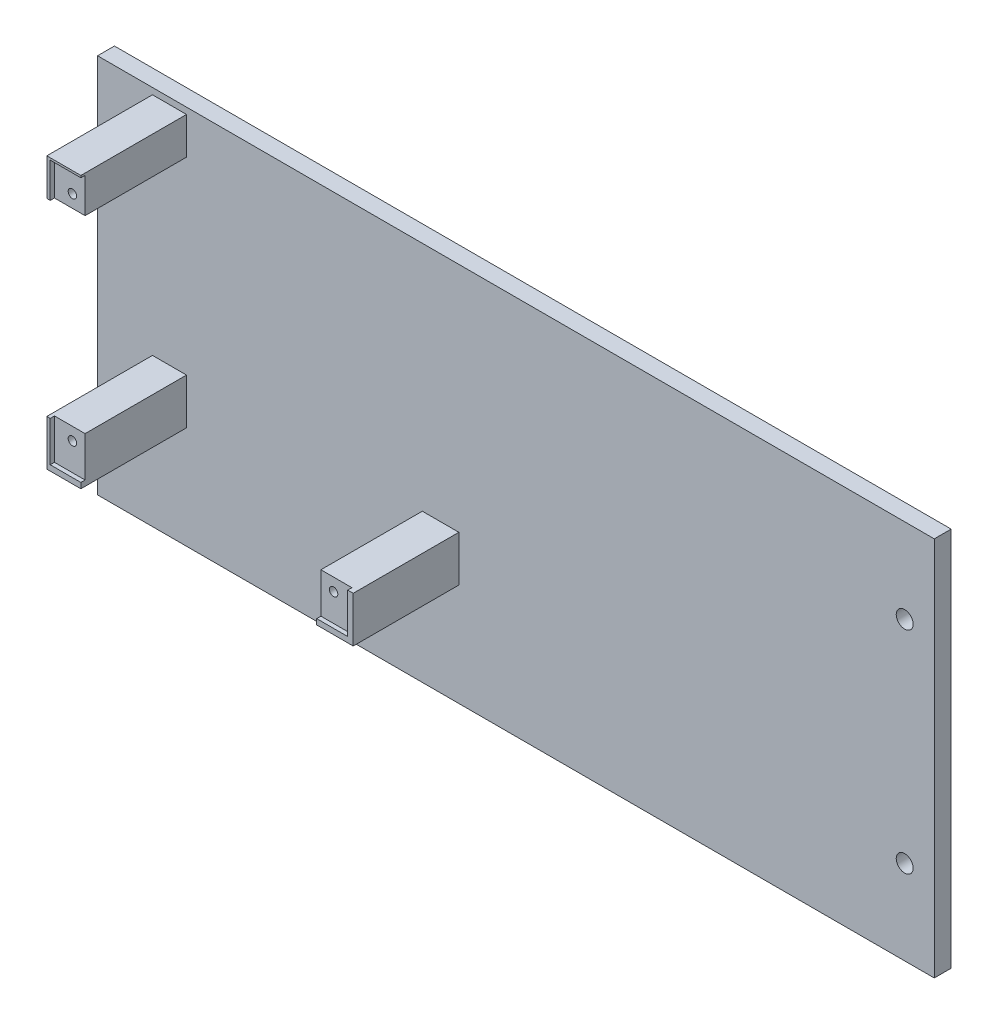
ISO-10303-21;
HEADER;
FILE_DESCRIPTION(('STEP AP214'),'2;1');
FILE_NAME('part.step','',(''),(''),'','','');
FILE_SCHEMA(('AUTOMOTIVE_DESIGN { 1 0 10303 214 1 1 1 1 }'));
ENDSEC;
DATA;
#1=APPLICATION_CONTEXT('core data for automotive mechanical design processes');
#2=APPLICATION_PROTOCOL_DEFINITION('international standard','automotive_design',2000,#1);
#3=PRODUCT_CONTEXT('',#1,'mechanical');
#4=PRODUCT('Part','Part','',(#3));
#5=PRODUCT_RELATED_PRODUCT_CATEGORY('part','',(#4));
#6=PRODUCT_DEFINITION_FORMATION('','',#4);
#7=PRODUCT_DEFINITION_CONTEXT('part definition',#1,'design');
#8=PRODUCT_DEFINITION('design','',#6,#7);
#9=PRODUCT_DEFINITION_SHAPE('','',#8);
#10=(LENGTH_UNIT() NAMED_UNIT(*) SI_UNIT(.MILLI.,.METRE.));
#11=(NAMED_UNIT(*) PLANE_ANGLE_UNIT() SI_UNIT($,.RADIAN.));
#12=(NAMED_UNIT(*) SI_UNIT($,.STERADIAN.) SOLID_ANGLE_UNIT());
#13=UNCERTAINTY_MEASURE_WITH_UNIT(LENGTH_MEASURE(1.E-05),#10,'distance_accuracy_value','');
#14=(GEOMETRIC_REPRESENTATION_CONTEXT(3) GLOBAL_UNCERTAINTY_ASSIGNED_CONTEXT((#13)) GLOBAL_UNIT_ASSIGNED_CONTEXT((#10,
#11,#12)) REPRESENTATION_CONTEXT('',''));
#15=CARTESIAN_POINT('',(0.,0.,0.));
#16=DIRECTION('',(0.,0.,1.));
#17=DIRECTION('',(1.,0.,0.));
#18=AXIS2_PLACEMENT_3D('',#15,#16,#17);
#19=CARTESIAN_POINT('',(0.,0.,4.));
#20=DIRECTION('',(0.,0.,-1.));
#21=DIRECTION('',(-1.,0.,0.));
#22=AXIS2_PLACEMENT_3D('',#19,#20,#21);
#23=PLANE('',#22);
#24=DIRECTION('',(-1.,0.,0.));
#25=VECTOR('',#24,1.);
#26=CARTESIAN_POINT('',(0.,88.5,4.));
#27=LINE('',#26,#25);
#28=CARTESIAN_POINT('',(21.0526525727963,88.5,4.));
#29=VERTEX_POINT('',#28);
#30=CARTESIAN_POINT('',(13.,88.5,4.));
#31=VERTEX_POINT('',#30);
#32=EDGE_CURVE('E292',#29,#31,#27,.T.);
#33=ORIENTED_EDGE('',*,*,#32,.F.);
#34=DIRECTION('',(0.,-1.,0.));
#35=VECTOR('',#34,1.);
#36=CARTESIAN_POINT('',(21.0526525727963,0.,4.));
#37=LINE('',#36,#35);
#38=CARTESIAN_POINT('',(21.0526525727963,79.7501847935628,4.));
#39=VERTEX_POINT('',#38);
#40=EDGE_CURVE('E347',#29,#39,#37,.T.);
#41=ORIENTED_EDGE('',*,*,#40,.T.);
#42=DIRECTION('',(-1.,0.,0.));
#43=VECTOR('',#42,1.);
#44=CARTESIAN_POINT('',(0.,79.7501847935628,4.));
#45=LINE('',#44,#43);
#46=CARTESIAN_POINT('',(13.,79.7501847935628,4.));
#47=VERTEX_POINT('',#46);
#48=EDGE_CURVE('E352',#39,#47,#45,.T.);
#49=ORIENTED_EDGE('',*,*,#48,.T.);
#50=DIRECTION('',(0.,-1.,0.));
#51=VECTOR('',#50,1.);
#52=CARTESIAN_POINT('',(13.,0.,4.));
#53=LINE('',#52,#51);
#54=EDGE_CURVE('E297',#31,#47,#53,.T.);
#55=ORIENTED_EDGE('',*,*,#54,.F.);
#56=EDGE_LOOP('',(#33,#41,#49,#55));
#57=FACE_BOUND('',#56,.T.);
#58=DIRECTION('',(-1.,0.,0.));
#59=VECTOR('',#58,1.);
#60=CARTESIAN_POINT('',(0.,24.2800212514805,4.));
#61=LINE('',#60,#59);
#62=CARTESIAN_POINT('',(85.5,24.2800212514805,4.));
#63=VERTEX_POINT('',#62);
#64=CARTESIAN_POINT('',(76.8556043079379,24.2800212514805,4.));
#65=VERTEX_POINT('',#64);
#66=EDGE_CURVE('E241',#63,#65,#61,.T.);
#67=ORIENTED_EDGE('',*,*,#66,.T.);
#68=DIRECTION('',(0.,1.,0.));
#69=VECTOR('',#68,1.);
#70=CARTESIAN_POINT('',(76.855604307938,2.21650946346992E-13,4.));
#71=LINE('',#70,#69);
#72=CARTESIAN_POINT('',(76.8556043079379,35.0920276336106,4.));
#73=VERTEX_POINT('',#72);
#74=EDGE_CURVE('E56',#65,#73,#71,.T.);
#75=ORIENTED_EDGE('',*,*,#74,.T.);
#76=DIRECTION('',(1.,0.,0.));
#77=VECTOR('',#76,1.);
#78=CARTESIAN_POINT('',(0.,35.0920276336106,4.));
#79=LINE('',#78,#77);
#80=CARTESIAN_POINT('',(85.5,35.0920276336106,4.));
#81=VERTEX_POINT('',#80);
#82=EDGE_CURVE('E334',#73,#81,#79,.T.);
#83=ORIENTED_EDGE('',*,*,#82,.T.);
#84=DIRECTION('',(0.,-1.,0.));
#85=VECTOR('',#84,1.);
#86=CARTESIAN_POINT('',(85.5,-1.09743817718166E-13,4.));
#87=LINE('',#86,#85);
#88=EDGE_CURVE('E63',#81,#63,#87,.T.);
#89=ORIENTED_EDGE('',*,*,#88,.T.);
#90=EDGE_LOOP('',(#67,#75,#83,#89));
#91=FACE_BOUND('',#90,.T.);
#92=CARTESIAN_POINT('',(191.,70.,4.));
#93=DIRECTION('',(0.,0.,-1.));
#94=DIRECTION('',(-1.,0.,0.));
#95=AXIS2_PLACEMENT_3D('',#92,#93,#94);
#96=CIRCLE('',#95,2.);
#97=CARTESIAN_POINT('',(189.,70.,4.));
#98=VERTEX_POINT('',#97);
#99=EDGE_CURVE('E398',#98,#98,#96,.T.);
#100=ORIENTED_EDGE('',*,*,#99,.T.);
#101=EDGE_LOOP('',(#100));
#102=FACE_BOUND('',#101,.T.);
#103=CARTESIAN_POINT('',(7.,20.,4.));
#104=DIRECTION('',(0.,0.,-1.));
#105=DIRECTION('',(-1.,0.,0.));
#106=AXIS2_PLACEMENT_3D('',#103,#104,#105);
#107=CIRCLE('',#106,2.);
#108=CARTESIAN_POINT('',(5.,20.,4.));
#109=VERTEX_POINT('',#108);
#110=EDGE_CURVE('E395',#109,#109,#107,.T.);
#111=ORIENTED_EDGE('',*,*,#110,.T.);
#112=EDGE_LOOP('',(#111));
#113=FACE_BOUND('',#112,.T.);
#114=CARTESIAN_POINT('',(7.00000000000001,70.,4.));
#115=DIRECTION('',(0.,0.,-1.));
#116=DIRECTION('',(-1.,0.,0.));
#117=AXIS2_PLACEMENT_3D('',#114,#115,#116);
#118=CIRCLE('',#117,2.);
#119=CARTESIAN_POINT('',(5.00000000000001,70.,4.));
#120=VERTEX_POINT('',#119);
#121=EDGE_CURVE('E387',#120,#120,#118,.T.);
#122=ORIENTED_EDGE('',*,*,#121,.T.);
#123=EDGE_LOOP('',(#122));
#124=FACE_BOUND('',#123,.T.);
#125=CARTESIAN_POINT('',(191.,20.,4.));
#126=DIRECTION('',(0.,0.,-1.));
#127=DIRECTION('',(-1.,0.,0.));
#128=AXIS2_PLACEMENT_3D('',#125,#126,#127);
#129=CIRCLE('',#128,2.);
#130=CARTESIAN_POINT('',(189.,20.,4.));
#131=VERTEX_POINT('',#130);
#132=EDGE_CURVE('E404',#131,#131,#129,.T.);
#133=ORIENTED_EDGE('',*,*,#132,.T.);
#134=EDGE_LOOP('',(#133));
#135=FACE_BOUND('',#134,.T.);
#136=DIRECTION('',(0.,-1.,0.));
#137=VECTOR('',#136,1.);
#138=CARTESIAN_POINT('',(0.,0.,4.));
#139=LINE('',#138,#137);
#140=CARTESIAN_POINT('',(0.,90.,4.));
#141=VERTEX_POINT('',#140);
#142=CARTESIAN_POINT('',(0.,0.,4.));
#143=VERTEX_POINT('',#142);
#144=EDGE_CURVE('E408',#141,#143,#139,.T.);
#145=ORIENTED_EDGE('',*,*,#144,.T.);
#146=DIRECTION('',(1.,0.,0.));
#147=VECTOR('',#146,1.);
#148=CARTESIAN_POINT('',(0.,0.,4.));
#149=LINE('',#148,#147);
#150=CARTESIAN_POINT('',(198.,0.,4.));
#151=VERTEX_POINT('',#150);
#152=EDGE_CURVE('E411',#143,#151,#149,.T.);
#153=ORIENTED_EDGE('',*,*,#152,.T.);
#154=DIRECTION('',(0.,1.,0.));
#155=VECTOR('',#154,1.);
#156=CARTESIAN_POINT('',(198.,0.,4.));
#157=LINE('',#156,#155);
#158=CARTESIAN_POINT('',(198.,90.,4.));
#159=VERTEX_POINT('',#158);
#160=EDGE_CURVE('E414',#151,#159,#157,.T.);
#161=ORIENTED_EDGE('',*,*,#160,.T.);
#162=DIRECTION('',(-1.,0.,0.));
#163=VECTOR('',#162,1.);
#164=CARTESIAN_POINT('',(0.,90.,4.));
#165=LINE('',#164,#163);
#166=EDGE_CURVE('E416',#159,#141,#165,.T.);
#167=ORIENTED_EDGE('',*,*,#166,.T.);
#168=EDGE_LOOP('',(#145,#153,#161,#167));
#169=FACE_BOUND('',#168,.T.);
#170=DIRECTION('',(0.,1.,0.));
#171=VECTOR('',#170,1.);
#172=CARTESIAN_POINT('',(21.0526525727964,0.,4.));
#173=LINE('',#172,#171);
#174=CARTESIAN_POINT('',(21.0526525727963,24.2800212514805,4.));
#175=VERTEX_POINT('',#174);
#176=CARTESIAN_POINT('',(21.0526525727963,35.0920276336106,4.));
#177=VERTEX_POINT('',#176);
#178=EDGE_CURVE('E366',#175,#177,#173,.T.);
#179=ORIENTED_EDGE('',*,*,#178,.F.);
#180=DIRECTION('',(1.,0.,0.));
#181=VECTOR('',#180,1.);
#182=CARTESIAN_POINT('',(0.,24.2800212514805,4.));
#183=LINE('',#182,#181);
#184=CARTESIAN_POINT('',(13.,24.2800212514805,4.));
#185=VERTEX_POINT('',#184);
#186=EDGE_CURVE('E215',#185,#175,#183,.T.);
#187=ORIENTED_EDGE('',*,*,#186,.F.);
#188=DIRECTION('',(0.,-1.,0.));
#189=VECTOR('',#188,1.);
#190=CARTESIAN_POINT('',(13.,0.,4.));
#191=LINE('',#190,#189);
#192=CARTESIAN_POINT('',(13.,35.0920276336106,4.));
#193=VERTEX_POINT('',#192);
#194=EDGE_CURVE('E260',#193,#185,#191,.T.);
#195=ORIENTED_EDGE('',*,*,#194,.F.);
#196=DIRECTION('',(-1.,0.,0.));
#197=VECTOR('',#196,1.);
#198=CARTESIAN_POINT('',(0.,35.0920276336106,4.));
#199=LINE('',#198,#197);
#200=EDGE_CURVE('E371',#177,#193,#199,.T.);
#201=ORIENTED_EDGE('',*,*,#200,.F.);
#202=EDGE_LOOP('',(#179,#187,#195,#201));
#203=FACE_BOUND('',#202,.T.);
#204=ADVANCED_FACE('F39',(#57,#91,#102,#113,#124,#135,#169,#203),#23,.F.);
#205=CARTESIAN_POINT('',(0.,0.,4.));
#206=DIRECTION('',(1.,0.,0.));
#207=DIRECTION('',(0.,0.,-1.));
#208=AXIS2_PLACEMENT_3D('',#205,#206,#207);
#209=PLANE('',#208);
#210=DIRECTION('',(0.,-1.,0.));
#211=VECTOR('',#210,1.);
#212=CARTESIAN_POINT('',(0.,0.,0.));
#213=LINE('',#212,#211);
#214=CARTESIAN_POINT('',(0.,90.,0.));
#215=VERTEX_POINT('',#214);
#216=CARTESIAN_POINT('',(0.,0.,0.));
#217=VERTEX_POINT('',#216);
#218=EDGE_CURVE('E407',#215,#217,#213,.T.);
#219=ORIENTED_EDGE('',*,*,#218,.T.);
#220=DIRECTION('',(0.,0.,-1.));
#221=VECTOR('',#220,1.);
#222=CARTESIAN_POINT('',(0.,0.,4.));
#223=LINE('',#222,#221);
#224=EDGE_CURVE('E11',#143,#217,#223,.T.);
#225=ORIENTED_EDGE('',*,*,#224,.F.);
#226=ORIENTED_EDGE('',*,*,#144,.F.);
#227=DIRECTION('',(0.,0.,-1.));
#228=VECTOR('',#227,1.);
#229=CARTESIAN_POINT('',(0.,90.,4.));
#230=LINE('',#229,#228);
#231=EDGE_CURVE('E418',#141,#215,#230,.T.);
#232=ORIENTED_EDGE('',*,*,#231,.T.);
#233=EDGE_LOOP('',(#219,#225,#226,#232));
#234=FACE_BOUND('',#233,.T.);
#235=ADVANCED_FACE('F41',(#234),#209,.F.);
#236=CARTESIAN_POINT('',(0.,0.,4.));
#237=DIRECTION('',(0.,1.,0.));
#238=DIRECTION('',(0.,0.,1.));
#239=AXIS2_PLACEMENT_3D('',#236,#237,#238);
#240=PLANE('',#239);
#241=DIRECTION('',(1.,0.,0.));
#242=VECTOR('',#241,1.);
#243=CARTESIAN_POINT('',(0.,0.,0.));
#244=LINE('',#243,#242);
#245=CARTESIAN_POINT('',(198.,0.,0.));
#246=VERTEX_POINT('',#245);
#247=EDGE_CURVE('E421',#217,#246,#244,.T.);
#248=ORIENTED_EDGE('',*,*,#247,.T.);
#249=DIRECTION('',(0.,0.,-1.));
#250=VECTOR('',#249,1.);
#251=CARTESIAN_POINT('',(198.,0.,4.));
#252=LINE('',#251,#250);
#253=EDGE_CURVE('E48',#151,#246,#252,.T.);
#254=ORIENTED_EDGE('',*,*,#253,.F.);
#255=ORIENTED_EDGE('',*,*,#152,.F.);
#256=ORIENTED_EDGE('',*,*,#224,.T.);
#257=EDGE_LOOP('',(#248,#254,#255,#256));
#258=FACE_BOUND('',#257,.T.);
#259=ADVANCED_FACE('F475',(#258),#240,.F.);
#260=CARTESIAN_POINT('',(198.,0.,4.));
#261=DIRECTION('',(-1.,0.,0.));
#262=DIRECTION('',(0.,0.,1.));
#263=AXIS2_PLACEMENT_3D('',#260,#261,#262);
#264=PLANE('',#263);
#265=DIRECTION('',(0.,1.,0.));
#266=VECTOR('',#265,1.);
#267=CARTESIAN_POINT('',(198.,0.,0.));
#268=LINE('',#267,#266);
#269=CARTESIAN_POINT('',(198.,90.,0.));
#270=VERTEX_POINT('',#269);
#271=EDGE_CURVE('E423',#246,#270,#268,.T.);
#272=ORIENTED_EDGE('',*,*,#271,.T.);
#273=DIRECTION('',(0.,0.,-1.));
#274=VECTOR('',#273,1.);
#275=CARTESIAN_POINT('',(198.,90.,4.));
#276=LINE('',#275,#274);
#277=EDGE_CURVE('E428',#159,#270,#276,.T.);
#278=ORIENTED_EDGE('',*,*,#277,.F.);
#279=ORIENTED_EDGE('',*,*,#160,.F.);
#280=ORIENTED_EDGE('',*,*,#253,.T.);
#281=EDGE_LOOP('',(#272,#278,#279,#280));
#282=FACE_BOUND('',#281,.T.);
#283=ADVANCED_FACE('F487',(#282),#264,.F.);
#284=CARTESIAN_POINT('',(0.,90.,4.));
#285=DIRECTION('',(0.,-1.,0.));
#286=DIRECTION('',(0.,0.,-1.));
#287=AXIS2_PLACEMENT_3D('',#284,#285,#286);
#288=PLANE('',#287);
#289=DIRECTION('',(-1.,0.,0.));
#290=VECTOR('',#289,1.);
#291=CARTESIAN_POINT('',(0.,90.,0.));
#292=LINE('',#291,#290);
#293=EDGE_CURVE('E412',#270,#215,#292,.T.);
#294=ORIENTED_EDGE('',*,*,#293,.T.);
#295=ORIENTED_EDGE('',*,*,#231,.F.);
#296=ORIENTED_EDGE('',*,*,#166,.F.);
#297=ORIENTED_EDGE('',*,*,#277,.T.);
#298=EDGE_LOOP('',(#294,#295,#296,#297));
#299=FACE_BOUND('',#298,.T.);
#300=ADVANCED_FACE('F484',(#299),#288,.F.);
#301=CARTESIAN_POINT('',(0.,0.,0.));
#302=DIRECTION('',(0.,0.,-1.));
#303=DIRECTION('',(-1.,0.,0.));
#304=AXIS2_PLACEMENT_3D('',#301,#302,#303);
#305=PLANE('',#304);
#306=CARTESIAN_POINT('',(18.0526525727963,32.0920276336106,0.));
#307=DIRECTION('',(0.,0.,1.));
#308=DIRECTION('',(1.,0.,0.));
#309=AXIS2_PLACEMENT_3D('',#306,#307,#308);
#310=CIRCLE('',#309,0.999999999999998);
#311=CARTESIAN_POINT('',(19.0526525727963,32.0920276336106,0.));
#312=VERTEX_POINT('',#311);
#313=EDGE_CURVE('E437',#312,#312,#310,.T.);
#314=ORIENTED_EDGE('',*,*,#313,.T.);
#315=EDGE_LOOP('',(#314));
#316=FACE_BOUND('',#315,.T.);
#317=CARTESIAN_POINT('',(79.8556043079379,32.0920276336106,0.));
#318=DIRECTION('',(0.,0.,1.));
#319=DIRECTION('',(1.,0.,0.));
#320=AXIS2_PLACEMENT_3D('',#317,#318,#319);
#321=CIRCLE('',#320,0.999999999999998);
#322=CARTESIAN_POINT('',(80.8556043079379,32.0920276336106,0.));
#323=VERTEX_POINT('',#322);
#324=EDGE_CURVE('E442',#323,#323,#321,.T.);
#325=ORIENTED_EDGE('',*,*,#324,.T.);
#326=EDGE_LOOP('',(#325));
#327=FACE_BOUND('',#326,.T.);
#328=CARTESIAN_POINT('',(18.0526525727963,82.7501847935628,0.));
#329=DIRECTION('',(0.,0.,1.));
#330=DIRECTION('',(1.,0.,0.));
#331=AXIS2_PLACEMENT_3D('',#328,#329,#330);
#332=CIRCLE('',#331,0.999999999999998);
#333=CARTESIAN_POINT('',(19.0526525727963,82.7501847935628,0.));
#334=VERTEX_POINT('',#333);
#335=EDGE_CURVE('E434',#334,#334,#332,.T.);
#336=ORIENTED_EDGE('',*,*,#335,.T.);
#337=EDGE_LOOP('',(#336));
#338=FACE_BOUND('',#337,.T.);
#339=CARTESIAN_POINT('',(191.,70.,0.));
#340=DIRECTION('',(0.,0.,-1.));
#341=DIRECTION('',(-1.,0.,0.));
#342=AXIS2_PLACEMENT_3D('',#339,#340,#341);
#343=CIRCLE('',#342,2.);
#344=CARTESIAN_POINT('',(189.,70.,0.));
#345=VERTEX_POINT('',#344);
#346=EDGE_CURVE('E384',#345,#345,#343,.T.);
#347=ORIENTED_EDGE('',*,*,#346,.F.);
#348=EDGE_LOOP('',(#347));
#349=FACE_BOUND('',#348,.T.);
#350=CARTESIAN_POINT('',(7.,20.,0.));
#351=DIRECTION('',(0.,0.,-1.));
#352=DIRECTION('',(-1.,0.,0.));
#353=AXIS2_PLACEMENT_3D('',#350,#351,#352);
#354=CIRCLE('',#353,2.);
#355=CARTESIAN_POINT('',(5.,20.,0.));
#356=VERTEX_POINT('',#355);
#357=EDGE_CURVE('E388',#356,#356,#354,.T.);
#358=ORIENTED_EDGE('',*,*,#357,.F.);
#359=EDGE_LOOP('',(#358));
#360=FACE_BOUND('',#359,.T.);
#361=CARTESIAN_POINT('',(7.00000000000001,70.,0.));
#362=DIRECTION('',(0.,0.,-1.));
#363=DIRECTION('',(-1.,0.,0.));
#364=AXIS2_PLACEMENT_3D('',#361,#362,#363);
#365=CIRCLE('',#364,2.);
#366=CARTESIAN_POINT('',(5.00000000000001,70.,0.));
#367=VERTEX_POINT('',#366);
#368=EDGE_CURVE('E383',#367,#367,#365,.T.);
#369=ORIENTED_EDGE('',*,*,#368,.F.);
#370=EDGE_LOOP('',(#369));
#371=FACE_BOUND('',#370,.T.);
#372=CARTESIAN_POINT('',(191.,20.,0.));
#373=DIRECTION('',(0.,0.,-1.));
#374=DIRECTION('',(-1.,0.,0.));
#375=AXIS2_PLACEMENT_3D('',#372,#373,#374);
#376=CIRCLE('',#375,2.);
#377=CARTESIAN_POINT('',(189.,20.,0.));
#378=VERTEX_POINT('',#377);
#379=EDGE_CURVE('E401',#378,#378,#376,.T.);
#380=ORIENTED_EDGE('',*,*,#379,.F.);
#381=EDGE_LOOP('',(#380));
#382=FACE_BOUND('',#381,.T.);
#383=ORIENTED_EDGE('',*,*,#218,.F.);
#384=ORIENTED_EDGE('',*,*,#293,.F.);
#385=ORIENTED_EDGE('',*,*,#271,.F.);
#386=ORIENTED_EDGE('',*,*,#247,.F.);
#387=EDGE_LOOP('',(#383,#384,#385,#386));
#388=FACE_BOUND('',#387,.T.);
#389=ADVANCED_FACE('F451',(#316,#327,#338,#349,#360,#371,#382,#388),#305,.T.);
#390=CARTESIAN_POINT('',(191.,20.,10.));
#391=DIRECTION('',(0.,0.,-1.));
#392=DIRECTION('',(-1.,0.,0.));
#393=AXIS2_PLACEMENT_3D('',#390,#391,#392);
#394=CYLINDRICAL_SURFACE('',#393,2.);
#395=ORIENTED_EDGE('',*,*,#379,.T.);
#396=EDGE_LOOP('',(#395));
#397=FACE_BOUND('',#396,.T.);
#398=ORIENTED_EDGE('',*,*,#132,.F.);
#399=EDGE_LOOP('',(#398));
#400=FACE_BOUND('',#399,.T.);
#401=ADVANCED_FACE('F480',(#397,#400),#394,.F.);
#402=CARTESIAN_POINT('',(7.00000000000001,70.,10.));
#403=DIRECTION('',(0.,0.,-1.));
#404=DIRECTION('',(-1.,0.,0.));
#405=AXIS2_PLACEMENT_3D('',#402,#403,#404);
#406=CYLINDRICAL_SURFACE('',#405,2.);
#407=ORIENTED_EDGE('',*,*,#368,.T.);
#408=EDGE_LOOP('',(#407));
#409=FACE_BOUND('',#408,.T.);
#410=ORIENTED_EDGE('',*,*,#121,.F.);
#411=EDGE_LOOP('',(#410));
#412=FACE_BOUND('',#411,.T.);
#413=ADVANCED_FACE('F606',(#409,#412),#406,.F.);
#414=CARTESIAN_POINT('',(7.,20.,10.));
#415=DIRECTION('',(0.,0.,-1.));
#416=DIRECTION('',(-1.,0.,0.));
#417=AXIS2_PLACEMENT_3D('',#414,#415,#416);
#418=CYLINDRICAL_SURFACE('',#417,2.);
#419=ORIENTED_EDGE('',*,*,#357,.T.);
#420=EDGE_LOOP('',(#419));
#421=FACE_BOUND('',#420,.T.);
#422=ORIENTED_EDGE('',*,*,#110,.F.);
#423=EDGE_LOOP('',(#422));
#424=FACE_BOUND('',#423,.T.);
#425=ADVANCED_FACE('F603',(#421,#424),#418,.F.);
#426=CARTESIAN_POINT('',(191.,70.,10.));
#427=DIRECTION('',(0.,0.,-1.));
#428=DIRECTION('',(-1.,0.,0.));
#429=AXIS2_PLACEMENT_3D('',#426,#427,#428);
#430=CYLINDRICAL_SURFACE('',#429,2.);
#431=ORIENTED_EDGE('',*,*,#346,.T.);
#432=EDGE_LOOP('',(#431));
#433=FACE_BOUND('',#432,.T.);
#434=ORIENTED_EDGE('',*,*,#99,.F.);
#435=EDGE_LOOP('',(#434));
#436=FACE_BOUND('',#435,.T.);
#437=ADVANCED_FACE('F600',(#433,#436),#430,.F.);
#438=CARTESIAN_POINT('',(21.0526525727964,0.,28.));
#439=DIRECTION('',(-1.,0.,0.));
#440=DIRECTION('',(0.,-1.,0.));
#441=AXIS2_PLACEMENT_3D('',#438,#439,#440);
#442=PLANE('',#441);
#443=ORIENTED_EDGE('',*,*,#178,.T.);
#444=DIRECTION('',(0.,0.,-1.));
#445=VECTOR('',#444,1.);
#446=CARTESIAN_POINT('',(21.0526525727963,35.0920276336106,28.));
#447=LINE('',#446,#445);
#448=CARTESIAN_POINT('',(21.0526525727963,35.0920276336106,28.));
#449=VERTEX_POINT('',#448);
#450=EDGE_CURVE('E378',#449,#177,#447,.T.);
#451=ORIENTED_EDGE('',*,*,#450,.F.);
#452=DIRECTION('',(0.,1.,0.));
#453=VECTOR('',#452,1.);
#454=CARTESIAN_POINT('',(21.0526525727964,0.,28.));
#455=LINE('',#454,#453);
#456=CARTESIAN_POINT('',(21.0526525727963,25.5800212514805,28.));
#457=VERTEX_POINT('',#456);
#458=EDGE_CURVE('E370',#457,#449,#455,.T.);
#459=ORIENTED_EDGE('',*,*,#458,.F.);
#460=DIRECTION('',(0.,0.,-1.));
#461=VECTOR('',#460,1.);
#462=CARTESIAN_POINT('',(21.0526525727963,25.5800212514805,29.));
#463=LINE('',#462,#461);
#464=CARTESIAN_POINT('',(21.0526525727963,25.5800212514805,29.));
#465=VERTEX_POINT('',#464);
#466=EDGE_CURVE('E286',#465,#457,#463,.T.);
#467=ORIENTED_EDGE('',*,*,#466,.F.);
#468=DIRECTION('',(0.,1.,0.));
#469=VECTOR('',#468,1.);
#470=CARTESIAN_POINT('',(21.0526525727964,0.,29.));
#471=LINE('',#470,#469);
#472=CARTESIAN_POINT('',(21.0526525727963,24.2800212514805,29.));
#473=VERTEX_POINT('',#472);
#474=EDGE_CURVE('E259',#473,#465,#471,.T.);
#475=ORIENTED_EDGE('',*,*,#474,.F.);
#476=DIRECTION('',(0.,0.,-1.));
#477=VECTOR('',#476,1.);
#478=CARTESIAN_POINT('',(21.0526525727963,24.2800212514805,29.));
#479=LINE('',#478,#477);
#480=EDGE_CURVE('E289',#473,#175,#479,.T.);
#481=ORIENTED_EDGE('',*,*,#480,.T.);
#482=EDGE_LOOP('',(#443,#451,#459,#467,#475,#481));
#483=FACE_BOUND('',#482,.T.);
#484=ADVANCED_FACE('F513',(#483),#442,.F.);
#485=CARTESIAN_POINT('',(0.,35.0920276336106,28.));
#486=DIRECTION('',(0.,-1.,0.));
#487=DIRECTION('',(0.,0.,-1.));
#488=AXIS2_PLACEMENT_3D('',#485,#486,#487);
#489=PLANE('',#488);
#490=ORIENTED_EDGE('',*,*,#200,.T.);
#491=DIRECTION('',(0.,0.,-1.));
#492=VECTOR('',#491,1.);
#493=CARTESIAN_POINT('',(13.,35.0920276336106,29.));
#494=LINE('',#493,#492);
#495=CARTESIAN_POINT('',(13.,35.0920276336106,29.));
#496=VERTEX_POINT('',#495);
#497=EDGE_CURVE('E277',#496,#193,#494,.T.);
#498=ORIENTED_EDGE('',*,*,#497,.F.);
#499=DIRECTION('',(-1.,0.,0.));
#500=VECTOR('',#499,1.);
#501=CARTESIAN_POINT('',(0.,35.0920276336106,29.));
#502=LINE('',#501,#500);
#503=CARTESIAN_POINT('',(13.8000000000001,35.0920276336106,29.));
#504=VERTEX_POINT('',#503);
#505=EDGE_CURVE('E266',#504,#496,#502,.T.);
#506=ORIENTED_EDGE('',*,*,#505,.F.);
#507=DIRECTION('',(0.,0.,-1.));
#508=VECTOR('',#507,1.);
#509=CARTESIAN_POINT('',(13.8000000000001,35.0920276336106,29.));
#510=LINE('',#509,#508);
#511=CARTESIAN_POINT('',(13.8000000000001,35.0920276336106,28.));
#512=VERTEX_POINT('',#511);
#513=EDGE_CURVE('E280',#504,#512,#510,.T.);
#514=ORIENTED_EDGE('',*,*,#513,.T.);
#515=DIRECTION('',(-1.,0.,0.));
#516=VECTOR('',#515,1.);
#517=CARTESIAN_POINT('',(0.,35.0920276336106,28.));
#518=LINE('',#517,#516);
#519=EDGE_CURVE('E373',#449,#512,#518,.T.);
#520=ORIENTED_EDGE('',*,*,#519,.F.);
#521=ORIENTED_EDGE('',*,*,#450,.T.);
#522=EDGE_LOOP('',(#490,#498,#506,#514,#520,#521));
#523=FACE_BOUND('',#522,.T.);
#524=ADVANCED_FACE('F525',(#523),#489,.F.);
#525=CARTESIAN_POINT('',(0.,0.,28.));
#526=DIRECTION('',(0.,0.,1.));
#527=DIRECTION('',(1.,0.,0.));
#528=AXIS2_PLACEMENT_3D('',#525,#526,#527);
#529=PLANE('',#528);
#530=CARTESIAN_POINT('',(18.0526525727963,32.0920276336106,28.));
#531=DIRECTION('',(0.,0.,1.));
#532=DIRECTION('',(1.,0.,0.));
#533=AXIS2_PLACEMENT_3D('',#530,#531,#532);
#534=CIRCLE('',#533,0.999999999999998);
#535=CARTESIAN_POINT('',(19.0526525727963,32.0920276336106,28.));
#536=VERTEX_POINT('',#535);
#537=EDGE_CURVE('E43',#536,#536,#534,.F.);
#538=ORIENTED_EDGE('',*,*,#537,.T.);
#539=EDGE_LOOP('',(#538));
#540=FACE_BOUND('',#539,.T.);
#541=DIRECTION('',(-1.,0.,0.));
#542=VECTOR('',#541,1.);
#543=CARTESIAN_POINT('',(0.,25.5800212514805,28.));
#544=LINE('',#543,#542);
#545=CARTESIAN_POINT('',(13.8000000000001,25.5800212514805,28.));
#546=VERTEX_POINT('',#545);
#547=EDGE_CURVE('E367',#457,#546,#544,.T.);
#548=ORIENTED_EDGE('',*,*,#547,.F.);
#549=ORIENTED_EDGE('',*,*,#458,.T.);
#550=ORIENTED_EDGE('',*,*,#519,.T.);
#551=DIRECTION('',(0.,1.,0.));
#552=VECTOR('',#551,1.);
#553=CARTESIAN_POINT('',(13.8000000000001,0.,28.));
#554=LINE('',#553,#552);
#555=EDGE_CURVE('E375',#546,#512,#554,.T.);
#556=ORIENTED_EDGE('',*,*,#555,.F.);
#557=EDGE_LOOP('',(#548,#549,#550,#556));
#558=FACE_BOUND('',#557,.T.);
#559=ADVANCED_FACE('F530',(#540,#558),#529,.T.);
#560=CARTESIAN_POINT('',(21.0526525727963,0.,28.));
#561=DIRECTION('',(1.,0.,0.));
#562=DIRECTION('',(0.,1.,0.));
#563=AXIS2_PLACEMENT_3D('',#560,#561,#562);
#564=PLANE('',#563);
#565=ORIENTED_EDGE('',*,*,#40,.F.);
#566=DIRECTION('',(0.,0.,-1.));
#567=VECTOR('',#566,1.);
#568=CARTESIAN_POINT('',(21.0526525727963,88.5,29.));
#569=LINE('',#568,#567);
#570=CARTESIAN_POINT('',(21.0526525727963,88.5,29.));
#571=VERTEX_POINT('',#570);
#572=EDGE_CURVE('E324',#571,#29,#569,.T.);
#573=ORIENTED_EDGE('',*,*,#572,.F.);
#574=DIRECTION('',(0.,1.,0.));
#575=VECTOR('',#574,1.);
#576=CARTESIAN_POINT('',(21.0526525727964,0.,29.));
#577=LINE('',#576,#575);
#578=CARTESIAN_POINT('',(21.0526525727963,88.016000509558,29.));
#579=VERTEX_POINT('',#578);
#580=EDGE_CURVE('E296',#579,#571,#577,.T.);
#581=ORIENTED_EDGE('',*,*,#580,.F.);
#582=DIRECTION('',(0.,0.,-1.));
#583=VECTOR('',#582,1.);
#584=CARTESIAN_POINT('',(21.0526525727963,88.016000509558,29.));
#585=LINE('',#584,#583);
#586=CARTESIAN_POINT('',(21.0526525727963,88.016000509558,28.));
#587=VERTEX_POINT('',#586);
#588=EDGE_CURVE('E327',#579,#587,#585,.T.);
#589=ORIENTED_EDGE('',*,*,#588,.T.);
#590=DIRECTION('',(0.,-1.,0.));
#591=VECTOR('',#590,1.);
#592=CARTESIAN_POINT('',(21.0526525727963,0.,28.));
#593=LINE('',#592,#591);
#594=CARTESIAN_POINT('',(21.0526525727963,79.7501847935628,28.));
#595=VERTEX_POINT('',#594);
#596=EDGE_CURVE('E348',#587,#595,#593,.T.);
#597=ORIENTED_EDGE('',*,*,#596,.T.);
#598=DIRECTION('',(0.,0.,-1.));
#599=VECTOR('',#598,1.);
#600=CARTESIAN_POINT('',(21.0526525727963,79.7501847935628,28.));
#601=LINE('',#600,#599);
#602=EDGE_CURVE('E361',#595,#39,#601,.T.);
#603=ORIENTED_EDGE('',*,*,#602,.T.);
#604=EDGE_LOOP('',(#565,#573,#581,#589,#597,#603));
#605=FACE_BOUND('',#604,.T.);
#606=ADVANCED_FACE('F588',(#605),#564,.T.);
#607=CARTESIAN_POINT('',(0.,79.7501847935628,28.));
#608=DIRECTION('',(0.,-1.,0.));
#609=DIRECTION('',(0.,0.,-1.));
#610=AXIS2_PLACEMENT_3D('',#607,#608,#609);
#611=PLANE('',#610);
#612=ORIENTED_EDGE('',*,*,#48,.F.);
#613=ORIENTED_EDGE('',*,*,#602,.F.);
#614=DIRECTION('',(-1.,0.,0.));
#615=VECTOR('',#614,1.);
#616=CARTESIAN_POINT('',(0.,79.7501847935628,28.));
#617=LINE('',#616,#615);
#618=CARTESIAN_POINT('',(13.8000000000001,79.7501847935628,28.));
#619=VERTEX_POINT('',#618);
#620=EDGE_CURVE('E358',#595,#619,#617,.T.);
#621=ORIENTED_EDGE('',*,*,#620,.T.);
#622=DIRECTION('',(0.,0.,-1.));
#623=VECTOR('',#622,1.);
#624=CARTESIAN_POINT('',(13.8000000000001,79.7501847935628,29.));
#625=LINE('',#624,#623);
#626=CARTESIAN_POINT('',(13.8000000000001,79.7501847935628,29.));
#627=VERTEX_POINT('',#626);
#628=EDGE_CURVE('E315',#627,#619,#625,.T.);
#629=ORIENTED_EDGE('',*,*,#628,.F.);
#630=DIRECTION('',(-1.,0.,0.));
#631=VECTOR('',#630,1.);
#632=CARTESIAN_POINT('',(0.,79.7501847935628,29.));
#633=LINE('',#632,#631);
#634=CARTESIAN_POINT('',(13.,79.7501847935628,29.));
#635=VERTEX_POINT('',#634);
#636=EDGE_CURVE('E303',#627,#635,#633,.T.);
#637=ORIENTED_EDGE('',*,*,#636,.T.);
#638=DIRECTION('',(0.,0.,-1.));
#639=VECTOR('',#638,1.);
#640=CARTESIAN_POINT('',(13.,79.7501847935628,29.));
#641=LINE('',#640,#639);
#642=EDGE_CURVE('E318',#635,#47,#641,.T.);
#643=ORIENTED_EDGE('',*,*,#642,.T.);
#644=EDGE_LOOP('',(#612,#613,#621,#629,#637,#643));
#645=FACE_BOUND('',#644,.T.);
#646=ADVANCED_FACE('F584',(#645),#611,.T.);
#647=CARTESIAN_POINT('',(0.,0.,28.));
#648=DIRECTION('',(0.,0.,1.));
#649=DIRECTION('',(1.,0.,0.));
#650=AXIS2_PLACEMENT_3D('',#647,#648,#649);
#651=PLANE('',#650);
#652=CARTESIAN_POINT('',(18.0526525727963,82.7501847935628,28.));
#653=DIRECTION('',(0.,0.,1.));
#654=DIRECTION('',(1.,0.,0.));
#655=AXIS2_PLACEMENT_3D('',#652,#653,#654);
#656=CIRCLE('',#655,0.999999999999998);
#657=CARTESIAN_POINT('',(19.0526525727963,82.7501847935628,28.));
#658=VERTEX_POINT('',#657);
#659=EDGE_CURVE('E243',#658,#658,#656,.F.);
#660=ORIENTED_EDGE('',*,*,#659,.T.);
#661=EDGE_LOOP('',(#660));
#662=FACE_BOUND('',#661,.T.);
#663=ORIENTED_EDGE('',*,*,#596,.F.);
#664=DIRECTION('',(1.,0.,0.));
#665=VECTOR('',#664,1.);
#666=CARTESIAN_POINT('',(0.,88.016000509558,28.));
#667=LINE('',#666,#665);
#668=CARTESIAN_POINT('',(13.8000000000001,88.016000509558,28.));
#669=VERTEX_POINT('',#668);
#670=EDGE_CURVE('E351',#669,#587,#667,.T.);
#671=ORIENTED_EDGE('',*,*,#670,.F.);
#672=DIRECTION('',(0.,1.,0.));
#673=VECTOR('',#672,1.);
#674=CARTESIAN_POINT('',(13.8000000000001,0.,28.));
#675=LINE('',#674,#673);
#676=EDGE_CURVE('E355',#619,#669,#675,.T.);
#677=ORIENTED_EDGE('',*,*,#676,.F.);
#678=ORIENTED_EDGE('',*,*,#620,.F.);
#679=EDGE_LOOP('',(#663,#671,#677,#678));
#680=FACE_BOUND('',#679,.T.);
#681=ADVANCED_FACE('F581',(#662,#680),#651,.T.);
#682=CARTESIAN_POINT('',(76.855604307938,2.21650946346992E-13,28.));
#683=DIRECTION('',(-1.,0.,0.));
#684=DIRECTION('',(0.,-1.,0.));
#685=AXIS2_PLACEMENT_3D('',#682,#683,#684);
#686=PLANE('',#685);
#687=ORIENTED_EDGE('',*,*,#74,.F.);
#688=DIRECTION('',(0.,0.,-1.));
#689=VECTOR('',#688,1.);
#690=CARTESIAN_POINT('',(76.8556043079379,24.2800212514805,29.));
#691=LINE('',#690,#689);
#692=CARTESIAN_POINT('',(76.8556043079379,24.2800212514805,29.));
#693=VERTEX_POINT('',#692);
#694=EDGE_CURVE('E207',#693,#65,#691,.T.);
#695=ORIENTED_EDGE('',*,*,#694,.F.);
#696=DIRECTION('',(0.,1.,0.));
#697=VECTOR('',#696,1.);
#698=CARTESIAN_POINT('',(76.855604307938,2.21650946346992E-13,29.));
#699=LINE('',#698,#697);
#700=CARTESIAN_POINT('',(76.8556043079379,25.5800212514805,29.));
#701=VERTEX_POINT('',#700);
#702=EDGE_CURVE('E211',#693,#701,#699,.T.);
#703=ORIENTED_EDGE('',*,*,#702,.T.);
#704=DIRECTION('',(0.,0.,-1.));
#705=VECTOR('',#704,1.);
#706=CARTESIAN_POINT('',(76.8556043079379,25.5800212514805,29.));
#707=LINE('',#706,#705);
#708=CARTESIAN_POINT('',(76.8556043079379,25.5800212514805,28.));
#709=VERTEX_POINT('',#708);
#710=EDGE_CURVE('E240',#701,#709,#707,.T.);
#711=ORIENTED_EDGE('',*,*,#710,.T.);
#712=DIRECTION('',(0.,1.,0.));
#713=VECTOR('',#712,1.);
#714=CARTESIAN_POINT('',(76.855604307938,2.21650946346992E-13,28.));
#715=LINE('',#714,#713);
#716=CARTESIAN_POINT('',(76.8556043079379,35.0920276336106,28.));
#717=VERTEX_POINT('',#716);
#718=EDGE_CURVE('E330',#709,#717,#715,.T.);
#719=ORIENTED_EDGE('',*,*,#718,.T.);
#720=DIRECTION('',(0.,0.,-1.));
#721=VECTOR('',#720,1.);
#722=CARTESIAN_POINT('',(76.8556043079379,35.0920276336106,28.));
#723=LINE('',#722,#721);
#724=EDGE_CURVE('E343',#717,#73,#723,.T.);
#725=ORIENTED_EDGE('',*,*,#724,.T.);
#726=EDGE_LOOP('',(#687,#695,#703,#711,#719,#725));
#727=FACE_BOUND('',#726,.T.);
#728=ADVANCED_FACE('F209',(#727),#686,.T.);
#729=CARTESIAN_POINT('',(0.,35.0920276336106,28.));
#730=DIRECTION('',(0.,1.,0.));
#731=DIRECTION('',(0.,0.,1.));
#732=AXIS2_PLACEMENT_3D('',#729,#730,#731);
#733=PLANE('',#732);
#734=ORIENTED_EDGE('',*,*,#82,.F.);
#735=ORIENTED_EDGE('',*,*,#724,.F.);
#736=DIRECTION('',(1.,0.,0.));
#737=VECTOR('',#736,1.);
#738=CARTESIAN_POINT('',(0.,35.0920276336106,28.));
#739=LINE('',#738,#737);
#740=CARTESIAN_POINT('',(84.2,35.0920276336106,28.));
#741=VERTEX_POINT('',#740);
#742=EDGE_CURVE('E340',#717,#741,#739,.T.);
#743=ORIENTED_EDGE('',*,*,#742,.T.);
#744=DIRECTION('',(0.,0.,-1.));
#745=VECTOR('',#744,1.);
#746=CARTESIAN_POINT('',(84.2,35.0920276336106,29.));
#747=LINE('',#746,#745);
#748=CARTESIAN_POINT('',(84.2,35.0920276336106,29.));
#749=VERTEX_POINT('',#748);
#750=EDGE_CURVE('E249',#749,#741,#747,.T.);
#751=ORIENTED_EDGE('',*,*,#750,.F.);
#752=DIRECTION('',(1.,0.,0.));
#753=VECTOR('',#752,1.);
#754=CARTESIAN_POINT('',(0.,35.0920276336106,29.));
#755=LINE('',#754,#753);
#756=CARTESIAN_POINT('',(85.5,35.0920276336106,29.));
#757=VERTEX_POINT('',#756);
#758=EDGE_CURVE('E231',#749,#757,#755,.T.);
#759=ORIENTED_EDGE('',*,*,#758,.T.);
#760=DIRECTION('',(0.,0.,-1.));
#761=VECTOR('',#760,1.);
#762=CARTESIAN_POINT('',(85.5,35.0920276336106,29.));
#763=LINE('',#762,#761);
#764=EDGE_CURVE('E252',#757,#81,#763,.T.);
#765=ORIENTED_EDGE('',*,*,#764,.T.);
#766=EDGE_LOOP('',(#734,#735,#743,#751,#759,#765));
#767=FACE_BOUND('',#766,.T.);
#768=ADVANCED_FACE('F575',(#767),#733,.T.);
#769=CARTESIAN_POINT('',(0.,0.,28.));
#770=DIRECTION('',(0.,0.,1.));
#771=DIRECTION('',(1.,0.,0.));
#772=AXIS2_PLACEMENT_3D('',#769,#770,#771);
#773=PLANE('',#772);
#774=CARTESIAN_POINT('',(79.8556043079379,32.0920276336106,28.));
#775=DIRECTION('',(0.,0.,1.));
#776=DIRECTION('',(1.,0.,0.));
#777=AXIS2_PLACEMENT_3D('',#774,#775,#776);
#778=CIRCLE('',#777,0.999999999999998);
#779=CARTESIAN_POINT('',(80.8556043079379,32.0920276336106,28.));
#780=VERTEX_POINT('',#779);
#781=EDGE_CURVE('E435',#780,#780,#778,.F.);
#782=ORIENTED_EDGE('',*,*,#781,.T.);
#783=EDGE_LOOP('',(#782));
#784=FACE_BOUND('',#783,.T.);
#785=ORIENTED_EDGE('',*,*,#718,.F.);
#786=DIRECTION('',(-1.,0.,0.));
#787=VECTOR('',#786,1.);
#788=CARTESIAN_POINT('',(0.,25.5800212514805,28.));
#789=LINE('',#788,#787);
#790=CARTESIAN_POINT('',(84.2,25.5800212514805,28.));
#791=VERTEX_POINT('',#790);
#792=EDGE_CURVE('E333',#791,#709,#789,.T.);
#793=ORIENTED_EDGE('',*,*,#792,.F.);
#794=DIRECTION('',(0.,-1.,0.));
#795=VECTOR('',#794,1.);
#796=CARTESIAN_POINT('',(84.2,1.22845768439897E-13,28.));
#797=LINE('',#796,#795);
#798=EDGE_CURVE('E337',#741,#791,#797,.T.);
#799=ORIENTED_EDGE('',*,*,#798,.F.);
#800=ORIENTED_EDGE('',*,*,#742,.F.);
#801=EDGE_LOOP('',(#785,#793,#799,#800));
#802=FACE_BOUND('',#801,.T.);
#803=ADVANCED_FACE('F571',(#784,#802),#773,.T.);
#804=CARTESIAN_POINT('',(0.,88.016000509558,29.));
#805=DIRECTION('',(0.,1.,0.));
#806=DIRECTION('',(0.,0.,1.));
#807=AXIS2_PLACEMENT_3D('',#804,#805,#806);
#808=PLANE('',#807);
#809=ORIENTED_EDGE('',*,*,#670,.T.);
#810=ORIENTED_EDGE('',*,*,#588,.F.);
#811=DIRECTION('',(1.,0.,0.));
#812=VECTOR('',#811,1.);
#813=CARTESIAN_POINT('',(0.,88.016000509558,29.));
#814=LINE('',#813,#812);
#815=CARTESIAN_POINT('',(13.8000000000001,88.016000509558,29.));
#816=VERTEX_POINT('',#815);
#817=EDGE_CURVE('E293',#816,#579,#814,.T.);
#818=ORIENTED_EDGE('',*,*,#817,.F.);
#819=DIRECTION('',(0.,0.,-1.));
#820=VECTOR('',#819,1.);
#821=CARTESIAN_POINT('',(13.8000000000001,88.016000509558,29.));
#822=LINE('',#821,#820);
#823=EDGE_CURVE('E308',#816,#669,#822,.T.);
#824=ORIENTED_EDGE('',*,*,#823,.T.);
#825=EDGE_LOOP('',(#809,#810,#818,#824));
#826=FACE_BOUND('',#825,.T.);
#827=ADVANCED_FACE('F567',(#826),#808,.F.);
#828=CARTESIAN_POINT('',(0.,88.5,29.));
#829=DIRECTION('',(0.,-1.,0.));
#830=DIRECTION('',(0.,0.,-1.));
#831=AXIS2_PLACEMENT_3D('',#828,#829,#830);
#832=PLANE('',#831);
#833=ORIENTED_EDGE('',*,*,#32,.T.);
#834=DIRECTION('',(0.,0.,-1.));
#835=VECTOR('',#834,1.);
#836=CARTESIAN_POINT('',(13.,88.5,29.));
#837=LINE('',#836,#835);
#838=CARTESIAN_POINT('',(13.,88.5,29.));
#839=VERTEX_POINT('',#838);
#840=EDGE_CURVE('E321',#839,#31,#837,.T.);
#841=ORIENTED_EDGE('',*,*,#840,.F.);
#842=DIRECTION('',(-1.,0.,0.));
#843=VECTOR('',#842,1.);
#844=CARTESIAN_POINT('',(0.,88.5,29.));
#845=LINE('',#844,#843);
#846=EDGE_CURVE('E299',#571,#839,#845,.T.);
#847=ORIENTED_EDGE('',*,*,#846,.F.);
#848=ORIENTED_EDGE('',*,*,#572,.T.);
#849=EDGE_LOOP('',(#833,#841,#847,#848));
#850=FACE_BOUND('',#849,.T.);
#851=ADVANCED_FACE('F563',(#850),#832,.F.);
#852=CARTESIAN_POINT('',(13.,0.,29.));
#853=DIRECTION('',(1.,0.,0.));
#854=DIRECTION('',(0.,1.,0.));
#855=AXIS2_PLACEMENT_3D('',#852,#853,#854);
#856=PLANE('',#855);
#857=ORIENTED_EDGE('',*,*,#54,.T.);
#858=ORIENTED_EDGE('',*,*,#642,.F.);
#859=DIRECTION('',(0.,-1.,0.));
#860=VECTOR('',#859,1.);
#861=CARTESIAN_POINT('',(13.,0.,29.));
#862=LINE('',#861,#860);
#863=EDGE_CURVE('E301',#839,#635,#862,.T.);
#864=ORIENTED_EDGE('',*,*,#863,.F.);
#865=ORIENTED_EDGE('',*,*,#840,.T.);
#866=EDGE_LOOP('',(#857,#858,#864,#865));
#867=FACE_BOUND('',#866,.T.);
#868=ADVANCED_FACE('F559',(#867),#856,.F.);
#869=CARTESIAN_POINT('',(13.8000000000001,0.,29.));
#870=DIRECTION('',(-1.,0.,0.));
#871=DIRECTION('',(0.,0.,1.));
#872=AXIS2_PLACEMENT_3D('',#869,#870,#871);
#873=PLANE('',#872);
#874=ORIENTED_EDGE('',*,*,#676,.T.);
#875=ORIENTED_EDGE('',*,*,#823,.F.);
#876=DIRECTION('',(0.,1.,0.));
#877=VECTOR('',#876,1.);
#878=CARTESIAN_POINT('',(13.8000000000001,0.,29.));
#879=LINE('',#878,#877);
#880=EDGE_CURVE('E306',#627,#816,#879,.T.);
#881=ORIENTED_EDGE('',*,*,#880,.F.);
#882=ORIENTED_EDGE('',*,*,#628,.T.);
#883=EDGE_LOOP('',(#874,#875,#881,#882));
#884=FACE_BOUND('',#883,.T.);
#885=ADVANCED_FACE('F555',(#884),#873,.F.);
#886=CARTESIAN_POINT('',(0.,0.,29.));
#887=DIRECTION('',(0.,0.,1.));
#888=DIRECTION('',(1.,0.,0.));
#889=AXIS2_PLACEMENT_3D('',#886,#887,#888);
#890=PLANE('',#889);
#891=ORIENTED_EDGE('',*,*,#817,.T.);
#892=ORIENTED_EDGE('',*,*,#580,.T.);
#893=ORIENTED_EDGE('',*,*,#846,.T.);
#894=ORIENTED_EDGE('',*,*,#863,.T.);
#895=ORIENTED_EDGE('',*,*,#636,.F.);
#896=ORIENTED_EDGE('',*,*,#880,.T.);
#897=EDGE_LOOP('',(#891,#892,#893,#894,#895,#896));
#898=FACE_BOUND('',#897,.T.);
#899=ADVANCED_FACE('F552',(#898),#890,.T.);
#900=CARTESIAN_POINT('',(0.,24.2800212514805,29.));
#901=DIRECTION('',(0.,1.,0.));
#902=DIRECTION('',(0.,0.,1.));
#903=AXIS2_PLACEMENT_3D('',#900,#901,#902);
#904=PLANE('',#903);
#905=ORIENTED_EDGE('',*,*,#186,.T.);
#906=ORIENTED_EDGE('',*,*,#480,.F.);
#907=DIRECTION('',(1.,0.,0.));
#908=VECTOR('',#907,1.);
#909=CARTESIAN_POINT('',(0.,24.2800212514805,29.));
#910=LINE('',#909,#908);
#911=CARTESIAN_POINT('',(13.,24.2800212514805,29.));
#912=VERTEX_POINT('',#911);
#913=EDGE_CURVE('E256',#912,#473,#910,.T.);
#914=ORIENTED_EDGE('',*,*,#913,.F.);
#915=DIRECTION('',(0.,0.,-1.));
#916=VECTOR('',#915,1.);
#917=CARTESIAN_POINT('',(13.,24.2800212514805,29.));
#918=LINE('',#917,#916);
#919=EDGE_CURVE('E270',#912,#185,#918,.T.);
#920=ORIENTED_EDGE('',*,*,#919,.T.);
#921=EDGE_LOOP('',(#905,#906,#914,#920));
#922=FACE_BOUND('',#921,.T.);
#923=ADVANCED_FACE('F517',(#922),#904,.F.);
#924=CARTESIAN_POINT('',(0.,25.5800212514805,29.));
#925=DIRECTION('',(0.,-1.,0.));
#926=DIRECTION('',(0.,0.,-1.));
#927=AXIS2_PLACEMENT_3D('',#924,#925,#926);
#928=PLANE('',#927);
#929=ORIENTED_EDGE('',*,*,#547,.T.);
#930=DIRECTION('',(0.,0.,-1.));
#931=VECTOR('',#930,1.);
#932=CARTESIAN_POINT('',(13.8000000000001,25.5800212514805,29.));
#933=LINE('',#932,#931);
#934=CARTESIAN_POINT('',(13.8000000000001,25.5800212514805,29.));
#935=VERTEX_POINT('',#934);
#936=EDGE_CURVE('E283',#935,#546,#933,.T.);
#937=ORIENTED_EDGE('',*,*,#936,.F.);
#938=DIRECTION('',(-1.,0.,0.));
#939=VECTOR('',#938,1.);
#940=CARTESIAN_POINT('',(0.,25.5800212514805,29.));
#941=LINE('',#940,#939);
#942=EDGE_CURVE('E262',#465,#935,#941,.T.);
#943=ORIENTED_EDGE('',*,*,#942,.F.);
#944=ORIENTED_EDGE('',*,*,#466,.T.);
#945=EDGE_LOOP('',(#929,#937,#943,#944));
#946=FACE_BOUND('',#945,.T.);
#947=ADVANCED_FACE('F533',(#946),#928,.F.);
#948=CARTESIAN_POINT('',(13.8000000000001,0.,29.));
#949=DIRECTION('',(-1.,0.,0.));
#950=DIRECTION('',(0.,0.,1.));
#951=AXIS2_PLACEMENT_3D('',#948,#949,#950);
#952=PLANE('',#951);
#953=ORIENTED_EDGE('',*,*,#555,.T.);
#954=ORIENTED_EDGE('',*,*,#513,.F.);
#955=DIRECTION('',(0.,1.,0.));
#956=VECTOR('',#955,1.);
#957=CARTESIAN_POINT('',(13.8000000000001,0.,29.));
#958=LINE('',#957,#956);
#959=EDGE_CURVE('E264',#935,#504,#958,.T.);
#960=ORIENTED_EDGE('',*,*,#959,.F.);
#961=ORIENTED_EDGE('',*,*,#936,.T.);
#962=EDGE_LOOP('',(#953,#954,#960,#961));
#963=FACE_BOUND('',#962,.T.);
#964=ADVANCED_FACE('F539',(#963),#952,.F.);
#965=CARTESIAN_POINT('',(13.,0.,29.));
#966=DIRECTION('',(1.,0.,0.));
#967=DIRECTION('',(0.,1.,0.));
#968=AXIS2_PLACEMENT_3D('',#965,#966,#967);
#969=PLANE('',#968);
#970=ORIENTED_EDGE('',*,*,#194,.T.);
#971=ORIENTED_EDGE('',*,*,#919,.F.);
#972=DIRECTION('',(0.,-1.,0.));
#973=VECTOR('',#972,1.);
#974=CARTESIAN_POINT('',(13.,0.,29.));
#975=LINE('',#974,#973);
#976=EDGE_CURVE('E268',#496,#912,#975,.T.);
#977=ORIENTED_EDGE('',*,*,#976,.F.);
#978=ORIENTED_EDGE('',*,*,#497,.T.);
#979=EDGE_LOOP('',(#970,#971,#977,#978));
#980=FACE_BOUND('',#979,.T.);
#981=ADVANCED_FACE('F521',(#980),#969,.F.);
#982=CARTESIAN_POINT('',(0.,0.,29.));
#983=DIRECTION('',(0.,0.,1.));
#984=DIRECTION('',(1.,0.,0.));
#985=AXIS2_PLACEMENT_3D('',#982,#983,#984);
#986=PLANE('',#985);
#987=ORIENTED_EDGE('',*,*,#913,.T.);
#988=ORIENTED_EDGE('',*,*,#474,.T.);
#989=ORIENTED_EDGE('',*,*,#942,.T.);
#990=ORIENTED_EDGE('',*,*,#959,.T.);
#991=ORIENTED_EDGE('',*,*,#505,.T.);
#992=ORIENTED_EDGE('',*,*,#976,.T.);
#993=EDGE_LOOP('',(#987,#988,#989,#990,#991,#992));
#994=FACE_BOUND('',#993,.T.);
#995=ADVANCED_FACE('F536',(#994),#986,.T.);
#996=CARTESIAN_POINT('',(0.,24.2800212514805,29.));
#997=DIRECTION('',(0.,-1.,0.));
#998=DIRECTION('',(0.,0.,-1.));
#999=AXIS2_PLACEMENT_3D('',#996,#997,#998);
#1000=PLANE('',#999);
#1001=ORIENTED_EDGE('',*,*,#66,.F.);
#1002=DIRECTION('',(0.,0.,-1.));
#1003=VECTOR('',#1002,1.);
#1004=CARTESIAN_POINT('',(85.5,24.2800212514805,29.));
#1005=LINE('',#1004,#1003);
#1006=CARTESIAN_POINT('',(85.5,24.2800212514805,29.));
#1007=VERTEX_POINT('',#1006);
#1008=EDGE_CURVE('E216',#1007,#63,#1005,.T.);
#1009=ORIENTED_EDGE('',*,*,#1008,.F.);
#1010=DIRECTION('',(-1.,0.,0.));
#1011=VECTOR('',#1010,1.);
#1012=CARTESIAN_POINT('',(0.,24.2800212514805,29.));
#1013=LINE('',#1012,#1011);
#1014=EDGE_CURVE('E222',#1007,#693,#1013,.T.);
#1015=ORIENTED_EDGE('',*,*,#1014,.T.);
#1016=ORIENTED_EDGE('',*,*,#694,.T.);
#1017=EDGE_LOOP('',(#1001,#1009,#1015,#1016));
#1018=FACE_BOUND('',#1017,.T.);
#1019=ADVANCED_FACE('F228',(#1018),#1000,.T.);
#1020=CARTESIAN_POINT('',(85.5,-1.09743817718166E-13,29.));
#1021=DIRECTION('',(1.,0.,0.));
#1022=DIRECTION('',(0.,1.,0.));
#1023=AXIS2_PLACEMENT_3D('',#1020,#1021,#1022);
#1024=PLANE('',#1023);
#1025=ORIENTED_EDGE('',*,*,#88,.F.);
#1026=ORIENTED_EDGE('',*,*,#764,.F.);
#1027=DIRECTION('',(0.,-1.,0.));
#1028=VECTOR('',#1027,1.);
#1029=CARTESIAN_POINT('',(85.5,-1.09743817718166E-13,29.));
#1030=LINE('',#1029,#1028);
#1031=EDGE_CURVE('E229',#757,#1007,#1030,.T.);
#1032=ORIENTED_EDGE('',*,*,#1031,.T.);
#1033=ORIENTED_EDGE('',*,*,#1008,.T.);
#1034=EDGE_LOOP('',(#1025,#1026,#1032,#1033));
#1035=FACE_BOUND('',#1034,.T.);
#1036=ADVANCED_FACE('F833',(#1035),#1024,.T.);
#1037=CARTESIAN_POINT('',(84.2,1.22845768439897E-13,29.));
#1038=DIRECTION('',(1.,0.,0.));
#1039=DIRECTION('',(0.,1.,0.));
#1040=AXIS2_PLACEMENT_3D('',#1037,#1038,#1039);
#1041=PLANE('',#1040);
#1042=ORIENTED_EDGE('',*,*,#798,.T.);
#1043=DIRECTION('',(0.,0.,-1.));
#1044=VECTOR('',#1043,1.);
#1045=CARTESIAN_POINT('',(84.2,25.5800212514805,29.));
#1046=LINE('',#1045,#1044);
#1047=CARTESIAN_POINT('',(84.2,25.5800212514805,29.));
#1048=VERTEX_POINT('',#1047);
#1049=EDGE_CURVE('E246',#1048,#791,#1046,.T.);
#1050=ORIENTED_EDGE('',*,*,#1049,.F.);
#1051=DIRECTION('',(0.,-1.,0.));
#1052=VECTOR('',#1051,1.);
#1053=CARTESIAN_POINT('',(84.2,1.22845768439897E-13,29.));
#1054=LINE('',#1053,#1052);
#1055=EDGE_CURVE('E237',#749,#1048,#1054,.T.);
#1056=ORIENTED_EDGE('',*,*,#1055,.F.);
#1057=ORIENTED_EDGE('',*,*,#750,.T.);
#1058=EDGE_LOOP('',(#1042,#1050,#1056,#1057));
#1059=FACE_BOUND('',#1058,.T.);
#1060=ADVANCED_FACE('F842',(#1059),#1041,.F.);
#1061=CARTESIAN_POINT('',(0.,25.5800212514805,29.));
#1062=DIRECTION('',(0.,-1.,0.));
#1063=DIRECTION('',(0.,0.,-1.));
#1064=AXIS2_PLACEMENT_3D('',#1061,#1062,#1063);
#1065=PLANE('',#1064);
#1066=ORIENTED_EDGE('',*,*,#792,.T.);
#1067=ORIENTED_EDGE('',*,*,#710,.F.);
#1068=DIRECTION('',(-1.,0.,0.));
#1069=VECTOR('',#1068,1.);
#1070=CARTESIAN_POINT('',(0.,25.5800212514805,29.));
#1071=LINE('',#1070,#1069);
#1072=EDGE_CURVE('E225',#1048,#701,#1071,.T.);
#1073=ORIENTED_EDGE('',*,*,#1072,.F.);
#1074=ORIENTED_EDGE('',*,*,#1049,.T.);
#1075=EDGE_LOOP('',(#1066,#1067,#1073,#1074));
#1076=FACE_BOUND('',#1075,.T.);
#1077=ADVANCED_FACE('F466',(#1076),#1065,.F.);
#1078=CARTESIAN_POINT('',(0.,0.,29.));
#1079=DIRECTION('',(0.,0.,1.));
#1080=DIRECTION('',(1.,0.,0.));
#1081=AXIS2_PLACEMENT_3D('',#1078,#1079,#1080);
#1082=PLANE('',#1081);
#1083=ORIENTED_EDGE('',*,*,#702,.F.);
#1084=ORIENTED_EDGE('',*,*,#1014,.F.);
#1085=ORIENTED_EDGE('',*,*,#1031,.F.);
#1086=ORIENTED_EDGE('',*,*,#758,.F.);
#1087=ORIENTED_EDGE('',*,*,#1055,.T.);
#1088=ORIENTED_EDGE('',*,*,#1072,.T.);
#1089=EDGE_LOOP('',(#1083,#1084,#1085,#1086,#1087,#1088));
#1090=FACE_BOUND('',#1089,.T.);
#1091=ADVANCED_FACE('F220',(#1090),#1082,.T.);
#1092=CARTESIAN_POINT('',(18.0526525727963,82.7501847935628,29.));
#1093=DIRECTION('',(0.,0.,-1.));
#1094=DIRECTION('',(-1.,0.,0.));
#1095=AXIS2_PLACEMENT_3D('',#1092,#1093,#1094);
#1096=CYLINDRICAL_SURFACE('',#1095,0.999999999999998);
#1097=ORIENTED_EDGE('',*,*,#659,.F.);
#1098=EDGE_LOOP('',(#1097));
#1099=FACE_BOUND('',#1098,.T.);
#1100=ORIENTED_EDGE('',*,*,#335,.F.);
#1101=EDGE_LOOP('',(#1100));
#1102=FACE_BOUND('',#1101,.T.);
#1103=ADVANCED_FACE('F454',(#1099,#1102),#1096,.F.);
#1104=CARTESIAN_POINT('',(79.8556043079379,32.0920276336106,29.));
#1105=DIRECTION('',(0.,0.,-1.));
#1106=DIRECTION('',(-1.,0.,0.));
#1107=AXIS2_PLACEMENT_3D('',#1104,#1105,#1106);
#1108=CYLINDRICAL_SURFACE('',#1107,0.999999999999998);
#1109=ORIENTED_EDGE('',*,*,#781,.F.);
#1110=EDGE_LOOP('',(#1109));
#1111=FACE_BOUND('',#1110,.T.);
#1112=ORIENTED_EDGE('',*,*,#324,.F.);
#1113=EDGE_LOOP('',(#1112));
#1114=FACE_BOUND('',#1113,.T.);
#1115=ADVANCED_FACE('F456',(#1111,#1114),#1108,.F.);
#1116=CARTESIAN_POINT('',(18.0526525727963,32.0920276336106,29.));
#1117=DIRECTION('',(0.,0.,-1.));
#1118=DIRECTION('',(-1.,0.,0.));
#1119=AXIS2_PLACEMENT_3D('',#1116,#1117,#1118);
#1120=CYLINDRICAL_SURFACE('',#1119,0.999999999999998);
#1121=ORIENTED_EDGE('',*,*,#537,.F.);
#1122=EDGE_LOOP('',(#1121));
#1123=FACE_BOUND('',#1122,.T.);
#1124=ORIENTED_EDGE('',*,*,#313,.F.);
#1125=EDGE_LOOP('',(#1124));
#1126=FACE_BOUND('',#1125,.T.);
#1127=ADVANCED_FACE('F463',(#1123,#1126),#1120,.F.);
#1128=CLOSED_SHELL('',(#204,#235,#259,#283,#300,#389,#401,#413,#425,#437,#484,#524,#559,#606,
#646,#681,#728,#768,#803,#827,#851,#868,#885,#899,#923,#947,#964,#981,#995,#1019,#1036,#1060,
#1077,#1091,#1103,#1115,#1127));
#1129=MANIFOLD_SOLID_BREP('B2',#1128);
#1130=ADVANCED_BREP_SHAPE_REPRESENTATION('',(#18,#1129),#14);
#1131=SHAPE_DEFINITION_REPRESENTATION(#9,#1130);
ENDSEC;
END-ISO-10303-21;
